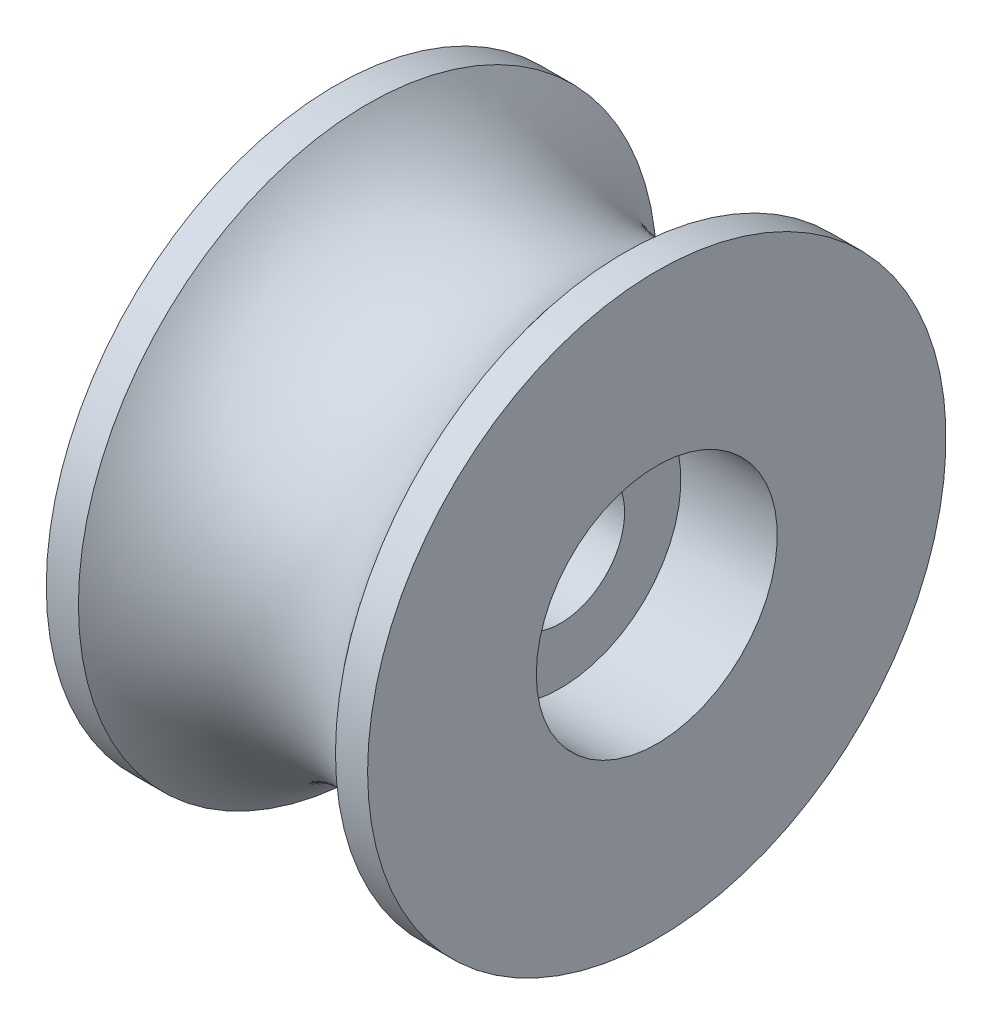
ISO-10303-21;
HEADER;
FILE_DESCRIPTION(('STEP AP214'),'2;1');
FILE_NAME('part.step','',(''),(''),'','','');
FILE_SCHEMA(('AUTOMOTIVE_DESIGN { 1 0 10303 214 1 1 1 1 }'));
ENDSEC;
DATA;
#1=APPLICATION_CONTEXT('core data for automotive mechanical design processes');
#2=APPLICATION_PROTOCOL_DEFINITION('international standard','automotive_design',2000,#1);
#3=PRODUCT_CONTEXT('',#1,'mechanical');
#4=PRODUCT('Part','Part','',(#3));
#5=PRODUCT_RELATED_PRODUCT_CATEGORY('part','',(#4));
#6=PRODUCT_DEFINITION_FORMATION('','',#4);
#7=PRODUCT_DEFINITION_CONTEXT('part definition',#1,'design');
#8=PRODUCT_DEFINITION('design','',#6,#7);
#9=PRODUCT_DEFINITION_SHAPE('','',#8);
#10=(LENGTH_UNIT() NAMED_UNIT(*) SI_UNIT(.MILLI.,.METRE.));
#11=(NAMED_UNIT(*) PLANE_ANGLE_UNIT() SI_UNIT($,.RADIAN.));
#12=(NAMED_UNIT(*) SI_UNIT($,.STERADIAN.) SOLID_ANGLE_UNIT());
#13=UNCERTAINTY_MEASURE_WITH_UNIT(LENGTH_MEASURE(1.E-05),#10,'distance_accuracy_value','');
#14=(GEOMETRIC_REPRESENTATION_CONTEXT(3) GLOBAL_UNCERTAINTY_ASSIGNED_CONTEXT((#13)) GLOBAL_UNIT_ASSIGNED_CONTEXT((#10,
#11,#12)) REPRESENTATION_CONTEXT('',''));
#15=CARTESIAN_POINT('',(0.,0.,0.));
#16=DIRECTION('',(0.,0.,1.));
#17=DIRECTION('',(1.,0.,0.));
#18=AXIS2_PLACEMENT_3D('',#15,#16,#17);
#19=CARTESIAN_POINT('',(0.,0.,0.));
#20=DIRECTION('',(-1.,0.,0.));
#21=DIRECTION('',(0.,0.,1.));
#22=AXIS2_PLACEMENT_3D('',#19,#20,#21);
#23=CYLINDRICAL_SURFACE('',#22,2.);
#24=CARTESIAN_POINT('',(2.,0.,0.));
#25=DIRECTION('',(-1.,0.,0.));
#26=DIRECTION('',(0.,0.,1.));
#27=AXIS2_PLACEMENT_3D('',#24,#25,#26);
#28=CIRCLE('',#27,2.);
#29=CARTESIAN_POINT('',(2.,0.,2.));
#30=VERTEX_POINT('',#29);
#31=EDGE_CURVE('E10',#30,#30,#28,.T.);
#32=ORIENTED_EDGE('',*,*,#31,.F.);
#33=EDGE_LOOP('',(#32));
#34=FACE_BOUND('',#33,.T.);
#35=CARTESIAN_POINT('',(-2.,0.,0.));
#36=DIRECTION('',(-1.,0.,0.));
#37=DIRECTION('',(0.,0.,1.));
#38=AXIS2_PLACEMENT_3D('',#35,#36,#37);
#39=CIRCLE('',#38,2.);
#40=CARTESIAN_POINT('',(-2.,0.,2.));
#41=VERTEX_POINT('',#40);
#42=EDGE_CURVE('E55',#41,#41,#39,.T.);
#43=ORIENTED_EDGE('',*,*,#42,.T.);
#44=EDGE_LOOP('',(#43));
#45=FACE_BOUND('',#44,.T.);
#46=ADVANCED_FACE('F33',(#34,#45),#23,.F.);
#47=CARTESIAN_POINT('',(2.,2.,0.));
#48=DIRECTION('',(-1.,0.,0.));
#49=DIRECTION('',(0.,0.,1.));
#50=AXIS2_PLACEMENT_3D('',#47,#48,#49);
#51=PLANE('',#50);
#52=CARTESIAN_POINT('',(2.,0.,0.));
#53=DIRECTION('',(-1.,0.,0.));
#54=DIRECTION('',(0.,0.,1.));
#55=AXIS2_PLACEMENT_3D('',#52,#53,#54);
#56=CIRCLE('',#55,3.75);
#57=CARTESIAN_POINT('',(2.,0.,3.75));
#58=VERTEX_POINT('',#57);
#59=EDGE_CURVE('E39',#58,#58,#56,.T.);
#60=ORIENTED_EDGE('',*,*,#59,.F.);
#61=EDGE_LOOP('',(#60));
#62=FACE_BOUND('',#61,.T.);
#63=ORIENTED_EDGE('',*,*,#31,.T.);
#64=EDGE_LOOP('',(#63));
#65=FACE_BOUND('',#64,.T.);
#66=ADVANCED_FACE('F91',(#62,#65),#51,.F.);
#67=CARTESIAN_POINT('',(0.,0.,0.));
#68=DIRECTION('',(-1.,0.,0.));
#69=DIRECTION('',(0.,0.,1.));
#70=AXIS2_PLACEMENT_3D('',#67,#68,#69);
#71=CYLINDRICAL_SURFACE('',#70,3.75);
#72=CARTESIAN_POINT('',(5.,0.,0.));
#73=DIRECTION('',(-1.,0.,0.));
#74=DIRECTION('',(0.,0.,1.));
#75=AXIS2_PLACEMENT_3D('',#72,#73,#74);
#76=CIRCLE('',#75,3.75);
#77=CARTESIAN_POINT('',(5.,0.,3.75));
#78=VERTEX_POINT('',#77);
#79=EDGE_CURVE('E43',#78,#78,#76,.T.);
#80=ORIENTED_EDGE('',*,*,#79,.F.);
#81=EDGE_LOOP('',(#80));
#82=FACE_BOUND('',#81,.T.);
#83=ORIENTED_EDGE('',*,*,#59,.T.);
#84=EDGE_LOOP('',(#83));
#85=FACE_BOUND('',#84,.T.);
#86=ADVANCED_FACE('F96',(#82,#85),#71,.F.);
#87=CARTESIAN_POINT('',(5.,3.75,0.));
#88=DIRECTION('',(-1.,0.,0.));
#89=DIRECTION('',(0.,0.,1.));
#90=AXIS2_PLACEMENT_3D('',#87,#88,#89);
#91=PLANE('',#90);
#92=CARTESIAN_POINT('',(5.,0.,0.));
#93=DIRECTION('',(-1.,0.,0.));
#94=DIRECTION('',(0.,0.,1.));
#95=AXIS2_PLACEMENT_3D('',#92,#93,#94);
#96=CIRCLE('',#95,9.);
#97=CARTESIAN_POINT('',(5.,0.,9.));
#98=VERTEX_POINT('',#97);
#99=EDGE_CURVE('E47',#98,#98,#96,.T.);
#100=ORIENTED_EDGE('',*,*,#99,.F.);
#101=EDGE_LOOP('',(#100));
#102=FACE_BOUND('',#101,.T.);
#103=ORIENTED_EDGE('',*,*,#79,.T.);
#104=EDGE_LOOP('',(#103));
#105=FACE_BOUND('',#104,.T.);
#106=ADVANCED_FACE('F87',(#102,#105),#91,.F.);
#107=CARTESIAN_POINT('',(0.,0.,0.));
#108=DIRECTION('',(-1.,0.,0.));
#109=DIRECTION('',(0.,0.,1.));
#110=AXIS2_PLACEMENT_3D('',#107,#108,#109);
#111=CYLINDRICAL_SURFACE('',#110,9.);
#112=CARTESIAN_POINT('',(4.,0.,0.));
#113=DIRECTION('',(-1.,0.,0.));
#114=DIRECTION('',(0.,0.,1.));
#115=AXIS2_PLACEMENT_3D('',#112,#113,#114);
#116=CIRCLE('',#115,9.);
#117=CARTESIAN_POINT('',(4.,0.,9.));
#118=VERTEX_POINT('',#117);
#119=EDGE_CURVE('E52',#118,#118,#116,.T.);
#120=ORIENTED_EDGE('',*,*,#119,.F.);
#121=EDGE_LOOP('',(#120));
#122=FACE_BOUND('',#121,.T.);
#123=ORIENTED_EDGE('',*,*,#99,.T.);
#124=EDGE_LOOP('',(#123));
#125=FACE_BOUND('',#124,.T.);
#126=ADVANCED_FACE('F77',(#122,#125),#111,.T.);
#127=CARTESIAN_POINT('',(0.,0.,0.));
#128=DIRECTION('',(-1.,0.,0.));
#129=DIRECTION('',(0.,0.,1.));
#130=AXIS2_PLACEMENT_3D('',#127,#128,#129);
#131=TOROIDAL_SURFACE('',#130,12.,5.);
#132=ORIENTED_EDGE('',*,*,#119,.T.);
#133=EDGE_LOOP('',(#132));
#134=FACE_BOUND('',#133,.T.);
#135=CARTESIAN_POINT('',(-4.,0.,0.));
#136=DIRECTION('',(-1.,0.,0.));
#137=DIRECTION('',(0.,0.,1.));
#138=AXIS2_PLACEMENT_3D('',#135,#136,#137);
#139=CIRCLE('',#138,9.);
#140=CARTESIAN_POINT('',(-4.,0.,9.));
#141=VERTEX_POINT('',#140);
#142=EDGE_CURVE('E67',#141,#141,#139,.T.);
#143=ORIENTED_EDGE('',*,*,#142,.F.);
#144=EDGE_LOOP('',(#143));
#145=FACE_BOUND('',#144,.T.);
#146=ADVANCED_FACE('F74',(#134,#145),#131,.F.);
#147=CARTESIAN_POINT('',(-2.,2.,0.));
#148=DIRECTION('',(1.,0.,0.));
#149=DIRECTION('',(0.,0.,1.));
#150=AXIS2_PLACEMENT_3D('',#147,#148,#149);
#151=PLANE('',#150);
#152=CARTESIAN_POINT('',(-2.,0.,0.));
#153=DIRECTION('',(-1.,0.,0.));
#154=DIRECTION('',(0.,0.,1.));
#155=AXIS2_PLACEMENT_3D('',#152,#153,#154);
#156=CIRCLE('',#155,3.75);
#157=CARTESIAN_POINT('',(-2.,0.,3.75));
#158=VERTEX_POINT('',#157);
#159=EDGE_CURVE('E58',#158,#158,#156,.T.);
#160=ORIENTED_EDGE('',*,*,#159,.T.);
#161=EDGE_LOOP('',(#160));
#162=FACE_BOUND('',#161,.T.);
#163=ORIENTED_EDGE('',*,*,#42,.F.);
#164=EDGE_LOOP('',(#163));
#165=FACE_BOUND('',#164,.T.);
#166=ADVANCED_FACE('F76',(#162,#165),#151,.F.);
#167=CARTESIAN_POINT('',(0.,0.,0.));
#168=DIRECTION('',(1.,0.,0.));
#169=DIRECTION('',(0.,0.,1.));
#170=AXIS2_PLACEMENT_3D('',#167,#168,#169);
#171=CYLINDRICAL_SURFACE('',#170,3.75);
#172=CARTESIAN_POINT('',(-5.,0.,0.));
#173=DIRECTION('',(-1.,0.,0.));
#174=DIRECTION('',(0.,0.,1.));
#175=AXIS2_PLACEMENT_3D('',#172,#173,#174);
#176=CIRCLE('',#175,3.75);
#177=CARTESIAN_POINT('',(-5.,0.,3.75));
#178=VERTEX_POINT('',#177);
#179=EDGE_CURVE('E61',#178,#178,#176,.T.);
#180=ORIENTED_EDGE('',*,*,#179,.T.);
#181=EDGE_LOOP('',(#180));
#182=FACE_BOUND('',#181,.T.);
#183=ORIENTED_EDGE('',*,*,#159,.F.);
#184=EDGE_LOOP('',(#183));
#185=FACE_BOUND('',#184,.T.);
#186=ADVANCED_FACE('F84',(#182,#185),#171,.F.);
#187=CARTESIAN_POINT('',(-5.,3.75,0.));
#188=DIRECTION('',(1.,0.,0.));
#189=DIRECTION('',(0.,0.,1.));
#190=AXIS2_PLACEMENT_3D('',#187,#188,#189);
#191=PLANE('',#190);
#192=CARTESIAN_POINT('',(-5.,0.,0.));
#193=DIRECTION('',(-1.,0.,0.));
#194=DIRECTION('',(0.,0.,1.));
#195=AXIS2_PLACEMENT_3D('',#192,#193,#194);
#196=CIRCLE('',#195,9.);
#197=CARTESIAN_POINT('',(-5.,0.,9.));
#198=VERTEX_POINT('',#197);
#199=EDGE_CURVE('E64',#198,#198,#196,.T.);
#200=ORIENTED_EDGE('',*,*,#199,.T.);
#201=EDGE_LOOP('',(#200));
#202=FACE_BOUND('',#201,.T.);
#203=ORIENTED_EDGE('',*,*,#179,.F.);
#204=EDGE_LOOP('',(#203));
#205=FACE_BOUND('',#204,.T.);
#206=ADVANCED_FACE('F146',(#202,#205),#191,.F.);
#207=CARTESIAN_POINT('',(0.,0.,0.));
#208=DIRECTION('',(1.,0.,0.));
#209=DIRECTION('',(0.,0.,1.));
#210=AXIS2_PLACEMENT_3D('',#207,#208,#209);
#211=CYLINDRICAL_SURFACE('',#210,9.);
#212=ORIENTED_EDGE('',*,*,#142,.T.);
#213=EDGE_LOOP('',(#212));
#214=FACE_BOUND('',#213,.T.);
#215=ORIENTED_EDGE('',*,*,#199,.F.);
#216=EDGE_LOOP('',(#215));
#217=FACE_BOUND('',#216,.T.);
#218=ADVANCED_FACE('F71',(#214,#217),#211,.T.);
#219=CLOSED_SHELL('',(#46,#66,#86,#106,#126,#146,#166,#186,#206,#218));
#220=MANIFOLD_SOLID_BREP('B2',#219);
#221=ADVANCED_BREP_SHAPE_REPRESENTATION('',(#18,#220),#14);
#222=SHAPE_DEFINITION_REPRESENTATION(#9,#221);
ENDSEC;
END-ISO-10303-21;
